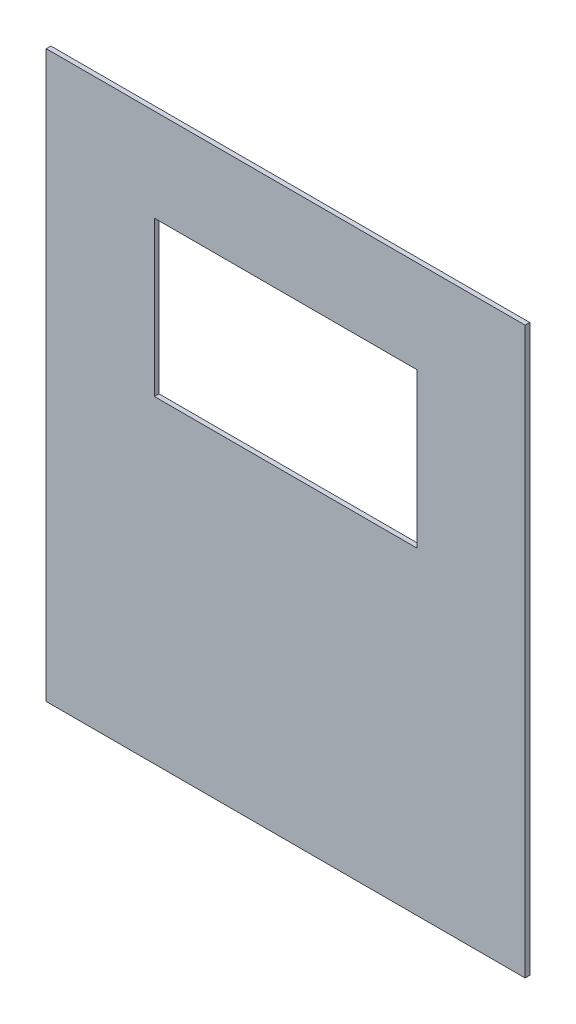
ISO-10303-21;
HEADER;
FILE_DESCRIPTION(('STEP AP214'),'2;1');
FILE_NAME('part.step','',(''),(''),'','','');
FILE_SCHEMA(('AUTOMOTIVE_DESIGN { 1 0 10303 214 1 1 1 1 }'));
ENDSEC;
DATA;
#1=APPLICATION_CONTEXT('core data for automotive mechanical design processes');
#2=APPLICATION_PROTOCOL_DEFINITION('international standard','automotive_design',2000,#1);
#3=PRODUCT_CONTEXT('',#1,'mechanical');
#4=PRODUCT('Part','Part','',(#3));
#5=PRODUCT_RELATED_PRODUCT_CATEGORY('part','',(#4));
#6=PRODUCT_DEFINITION_FORMATION('','',#4);
#7=PRODUCT_DEFINITION_CONTEXT('part definition',#1,'design');
#8=PRODUCT_DEFINITION('design','',#6,#7);
#9=PRODUCT_DEFINITION_SHAPE('','',#8);
#10=(LENGTH_UNIT() NAMED_UNIT(*) SI_UNIT(.MILLI.,.METRE.));
#11=(NAMED_UNIT(*) PLANE_ANGLE_UNIT() SI_UNIT($,.RADIAN.));
#12=(NAMED_UNIT(*) SI_UNIT($,.STERADIAN.) SOLID_ANGLE_UNIT());
#13=UNCERTAINTY_MEASURE_WITH_UNIT(LENGTH_MEASURE(1.E-05),#10,'distance_accuracy_value','');
#14=(GEOMETRIC_REPRESENTATION_CONTEXT(3) GLOBAL_UNCERTAINTY_ASSIGNED_CONTEXT((#13)) GLOBAL_UNIT_ASSIGNED_CONTEXT((#10,
#11,#12)) REPRESENTATION_CONTEXT('',''));
#15=CARTESIAN_POINT('',(0.,0.,0.));
#16=DIRECTION('',(0.,0.,1.));
#17=DIRECTION('',(1.,0.,0.));
#18=AXIS2_PLACEMENT_3D('',#15,#16,#17);
#19=CARTESIAN_POINT('',(0.,0.,3.));
#20=DIRECTION('',(0.,0.,-1.));
#21=DIRECTION('',(-1.,0.,0.));
#22=AXIS2_PLACEMENT_3D('',#19,#20,#21);
#23=PLANE('',#22);
#24=DIRECTION('',(0.,-1.,0.));
#25=VECTOR('',#24,1.);
#26=CARTESIAN_POINT('',(0.,0.,3.));
#27=LINE('',#26,#25);
#28=CARTESIAN_POINT('',(0.,366.,3.));
#29=VERTEX_POINT('',#28);
#30=CARTESIAN_POINT('',(0.,0.,3.));
#31=VERTEX_POINT('',#30);
#32=EDGE_CURVE('E157',#29,#31,#27,.T.);
#33=ORIENTED_EDGE('',*,*,#32,.T.);
#34=DIRECTION('',(1.,0.,0.));
#35=VECTOR('',#34,1.);
#36=CARTESIAN_POINT('',(0.,0.,3.));
#37=LINE('',#36,#35);
#38=CARTESIAN_POINT('',(310.,0.,3.));
#39=VERTEX_POINT('',#38);
#40=EDGE_CURVE('E161',#31,#39,#37,.T.);
#41=ORIENTED_EDGE('',*,*,#40,.T.);
#42=DIRECTION('',(0.,1.,0.));
#43=VECTOR('',#42,1.);
#44=CARTESIAN_POINT('',(310.,0.,3.));
#45=LINE('',#44,#43);
#46=CARTESIAN_POINT('',(310.,366.,3.));
#47=VERTEX_POINT('',#46);
#48=EDGE_CURVE('E165',#39,#47,#45,.T.);
#49=ORIENTED_EDGE('',*,*,#48,.T.);
#50=DIRECTION('',(-1.,0.,0.));
#51=VECTOR('',#50,1.);
#52=CARTESIAN_POINT('',(0.,366.,3.));
#53=LINE('',#52,#51);
#54=EDGE_CURVE('E168',#47,#29,#53,.T.);
#55=ORIENTED_EDGE('',*,*,#54,.T.);
#56=EDGE_LOOP('',(#33,#41,#49,#55));
#57=FACE_BOUND('',#56,.T.);
#58=DIRECTION('',(0.,1.,0.));
#59=VECTOR('',#58,1.);
#60=CARTESIAN_POINT('',(240.,306.,3.));
#61=LINE('',#60,#59);
#62=CARTESIAN_POINT('',(240.,206.,3.));
#63=VERTEX_POINT('',#62);
#64=CARTESIAN_POINT('',(240.,306.,3.));
#65=VERTEX_POINT('',#64);
#66=EDGE_CURVE('E109',#63,#65,#61,.T.);
#67=ORIENTED_EDGE('',*,*,#66,.F.);
#68=DIRECTION('',(1.,0.,0.));
#69=VECTOR('',#68,1.);
#70=CARTESIAN_POINT('',(240.,206.,3.));
#71=LINE('',#70,#69);
#72=CARTESIAN_POINT('',(70.,206.,3.));
#73=VERTEX_POINT('',#72);
#74=EDGE_CURVE('E135',#73,#63,#71,.T.);
#75=ORIENTED_EDGE('',*,*,#74,.F.);
#76=DIRECTION('',(0.,-1.,0.));
#77=VECTOR('',#76,1.);
#78=CARTESIAN_POINT('',(70.,306.,3.));
#79=LINE('',#78,#77);
#80=CARTESIAN_POINT('',(70.,306.,3.));
#81=VERTEX_POINT('',#80);
#82=EDGE_CURVE('E131',#81,#73,#79,.T.);
#83=ORIENTED_EDGE('',*,*,#82,.F.);
#84=DIRECTION('',(-1.,0.,0.));
#85=VECTOR('',#84,1.);
#86=CARTESIAN_POINT('',(240.,306.,3.));
#87=LINE('',#86,#85);
#88=EDGE_CURVE('E118',#65,#81,#87,.T.);
#89=ORIENTED_EDGE('',*,*,#88,.F.);
#90=EDGE_LOOP('',(#67,#75,#83,#89));
#91=FACE_BOUND('',#90,.T.);
#92=ADVANCED_FACE('F43',(#57,#91),#23,.F.);
#93=CARTESIAN_POINT('',(0.,0.,0.));
#94=DIRECTION('',(0.,0.,-1.));
#95=DIRECTION('',(-1.,0.,0.));
#96=AXIS2_PLACEMENT_3D('',#93,#94,#95);
#97=PLANE('',#96);
#98=DIRECTION('',(0.,-1.,0.));
#99=VECTOR('',#98,1.);
#100=CARTESIAN_POINT('',(0.,0.,0.));
#101=LINE('',#100,#99);
#102=CARTESIAN_POINT('',(0.,366.,0.));
#103=VERTEX_POINT('',#102);
#104=CARTESIAN_POINT('',(0.,0.,0.));
#105=VERTEX_POINT('',#104);
#106=EDGE_CURVE('E127',#103,#105,#101,.T.);
#107=ORIENTED_EDGE('',*,*,#106,.F.);
#108=DIRECTION('',(-1.,0.,0.));
#109=VECTOR('',#108,1.);
#110=CARTESIAN_POINT('',(0.,366.,0.));
#111=LINE('',#110,#109);
#112=CARTESIAN_POINT('',(310.,366.,0.));
#113=VERTEX_POINT('',#112);
#114=EDGE_CURVE('E162',#113,#103,#111,.T.);
#115=ORIENTED_EDGE('',*,*,#114,.F.);
#116=DIRECTION('',(0.,1.,0.));
#117=VECTOR('',#116,1.);
#118=CARTESIAN_POINT('',(310.,0.,0.));
#119=LINE('',#118,#117);
#120=CARTESIAN_POINT('',(310.,0.,0.));
#121=VERTEX_POINT('',#120);
#122=EDGE_CURVE('E178',#121,#113,#119,.T.);
#123=ORIENTED_EDGE('',*,*,#122,.F.);
#124=DIRECTION('',(1.,0.,0.));
#125=VECTOR('',#124,1.);
#126=CARTESIAN_POINT('',(0.,0.,0.));
#127=LINE('',#126,#125);
#128=EDGE_CURVE('E175',#105,#121,#127,.T.);
#129=ORIENTED_EDGE('',*,*,#128,.F.);
#130=EDGE_LOOP('',(#107,#115,#123,#129));
#131=FACE_BOUND('',#130,.T.);
#132=DIRECTION('',(1.,0.,0.));
#133=VECTOR('',#132,1.);
#134=CARTESIAN_POINT('',(240.,206.,0.));
#135=LINE('',#134,#133);
#136=CARTESIAN_POINT('',(70.,206.,0.));
#137=VERTEX_POINT('',#136);
#138=CARTESIAN_POINT('',(240.,206.,0.));
#139=VERTEX_POINT('',#138);
#140=EDGE_CURVE('E119',#137,#139,#135,.T.);
#141=ORIENTED_EDGE('',*,*,#140,.T.);
#142=DIRECTION('',(0.,1.,0.));
#143=VECTOR('',#142,1.);
#144=CARTESIAN_POINT('',(240.,306.,0.));
#145=LINE('',#144,#143);
#146=CARTESIAN_POINT('',(240.,306.,0.));
#147=VERTEX_POINT('',#146);
#148=EDGE_CURVE('E67',#139,#147,#145,.T.);
#149=ORIENTED_EDGE('',*,*,#148,.T.);
#150=DIRECTION('',(-1.,0.,0.));
#151=VECTOR('',#150,1.);
#152=CARTESIAN_POINT('',(240.,306.,0.));
#153=LINE('',#152,#151);
#154=CARTESIAN_POINT('',(70.,306.,0.));
#155=VERTEX_POINT('',#154);
#156=EDGE_CURVE('E125',#147,#155,#153,.T.);
#157=ORIENTED_EDGE('',*,*,#156,.T.);
#158=DIRECTION('',(0.,-1.,0.));
#159=VECTOR('',#158,1.);
#160=CARTESIAN_POINT('',(70.,306.,0.));
#161=LINE('',#160,#159);
#162=EDGE_CURVE('E144',#155,#137,#161,.T.);
#163=ORIENTED_EDGE('',*,*,#162,.T.);
#164=EDGE_LOOP('',(#141,#149,#157,#163));
#165=FACE_BOUND('',#164,.T.);
#166=ADVANCED_FACE('F201',(#131,#165),#97,.T.);
#167=CARTESIAN_POINT('',(0.,0.,3.));
#168=DIRECTION('',(1.,0.,0.));
#169=DIRECTION('',(0.,0.,-1.));
#170=AXIS2_PLACEMENT_3D('',#167,#168,#169);
#171=PLANE('',#170);
#172=ORIENTED_EDGE('',*,*,#106,.T.);
#173=DIRECTION('',(0.,0.,-1.));
#174=VECTOR('',#173,1.);
#175=CARTESIAN_POINT('',(0.,0.,3.));
#176=LINE('',#175,#174);
#177=EDGE_CURVE('E11',#31,#105,#176,.T.);
#178=ORIENTED_EDGE('',*,*,#177,.F.);
#179=ORIENTED_EDGE('',*,*,#32,.F.);
#180=DIRECTION('',(0.,0.,-1.));
#181=VECTOR('',#180,1.);
#182=CARTESIAN_POINT('',(0.,366.,3.));
#183=LINE('',#182,#181);
#184=EDGE_CURVE('E171',#29,#103,#183,.T.);
#185=ORIENTED_EDGE('',*,*,#184,.T.);
#186=EDGE_LOOP('',(#172,#178,#179,#185));
#187=FACE_BOUND('',#186,.T.);
#188=ADVANCED_FACE('F45',(#187),#171,.F.);
#189=CARTESIAN_POINT('',(0.,0.,3.));
#190=DIRECTION('',(0.,1.,0.));
#191=DIRECTION('',(0.,0.,1.));
#192=AXIS2_PLACEMENT_3D('',#189,#190,#191);
#193=PLANE('',#192);
#194=ORIENTED_EDGE('',*,*,#128,.T.);
#195=DIRECTION('',(0.,0.,-1.));
#196=VECTOR('',#195,1.);
#197=CARTESIAN_POINT('',(310.,0.,3.));
#198=LINE('',#197,#196);
#199=EDGE_CURVE('E52',#39,#121,#198,.T.);
#200=ORIENTED_EDGE('',*,*,#199,.F.);
#201=ORIENTED_EDGE('',*,*,#40,.F.);
#202=ORIENTED_EDGE('',*,*,#177,.T.);
#203=EDGE_LOOP('',(#194,#200,#201,#202));
#204=FACE_BOUND('',#203,.T.);
#205=ADVANCED_FACE('F211',(#204),#193,.F.);
#206=CARTESIAN_POINT('',(310.,0.,3.));
#207=DIRECTION('',(-1.,0.,0.));
#208=DIRECTION('',(0.,0.,1.));
#209=AXIS2_PLACEMENT_3D('',#206,#207,#208);
#210=PLANE('',#209);
#211=ORIENTED_EDGE('',*,*,#122,.T.);
#212=DIRECTION('',(0.,0.,-1.));
#213=VECTOR('',#212,1.);
#214=CARTESIAN_POINT('',(310.,366.,3.));
#215=LINE('',#214,#213);
#216=EDGE_CURVE('E186',#47,#113,#215,.T.);
#217=ORIENTED_EDGE('',*,*,#216,.F.);
#218=ORIENTED_EDGE('',*,*,#48,.F.);
#219=ORIENTED_EDGE('',*,*,#199,.T.);
#220=EDGE_LOOP('',(#211,#217,#218,#219));
#221=FACE_BOUND('',#220,.T.);
#222=ADVANCED_FACE('F195',(#221),#210,.F.);
#223=CARTESIAN_POINT('',(0.,366.,3.));
#224=DIRECTION('',(0.,-1.,0.));
#225=DIRECTION('',(0.,0.,-1.));
#226=AXIS2_PLACEMENT_3D('',#223,#224,#225);
#227=PLANE('',#226);
#228=ORIENTED_EDGE('',*,*,#114,.T.);
#229=ORIENTED_EDGE('',*,*,#184,.F.);
#230=ORIENTED_EDGE('',*,*,#54,.F.);
#231=ORIENTED_EDGE('',*,*,#216,.T.);
#232=EDGE_LOOP('',(#228,#229,#230,#231));
#233=FACE_BOUND('',#232,.T.);
#234=ADVANCED_FACE('F205',(#233),#227,.F.);
#235=CARTESIAN_POINT('',(240.,306.,3.));
#236=DIRECTION('',(-1.,0.,0.));
#237=DIRECTION('',(0.,-1.,0.));
#238=AXIS2_PLACEMENT_3D('',#235,#236,#237);
#239=PLANE('',#238);
#240=ORIENTED_EDGE('',*,*,#148,.F.);
#241=DIRECTION('',(0.,0.,-1.));
#242=VECTOR('',#241,1.);
#243=CARTESIAN_POINT('',(240.,206.,3.));
#244=LINE('',#243,#242);
#245=EDGE_CURVE('E113',#63,#139,#244,.T.);
#246=ORIENTED_EDGE('',*,*,#245,.F.);
#247=ORIENTED_EDGE('',*,*,#66,.T.);
#248=DIRECTION('',(0.,0.,-1.));
#249=VECTOR('',#248,1.);
#250=CARTESIAN_POINT('',(240.,306.,3.));
#251=LINE('',#250,#249);
#252=EDGE_CURVE('E112',#65,#147,#251,.T.);
#253=ORIENTED_EDGE('',*,*,#252,.T.);
#254=EDGE_LOOP('',(#240,#246,#247,#253));
#255=FACE_BOUND('',#254,.T.);
#256=ADVANCED_FACE('F111',(#255),#239,.T.);
#257=CARTESIAN_POINT('',(240.,306.,3.));
#258=DIRECTION('',(0.,-1.,0.));
#259=DIRECTION('',(1.,0.,0.));
#260=AXIS2_PLACEMENT_3D('',#257,#258,#259);
#261=PLANE('',#260);
#262=ORIENTED_EDGE('',*,*,#156,.F.);
#263=ORIENTED_EDGE('',*,*,#252,.F.);
#264=ORIENTED_EDGE('',*,*,#88,.T.);
#265=DIRECTION('',(0.,0.,-1.));
#266=VECTOR('',#265,1.);
#267=CARTESIAN_POINT('',(70.,306.,3.));
#268=LINE('',#267,#266);
#269=EDGE_CURVE('E128',#81,#155,#268,.T.);
#270=ORIENTED_EDGE('',*,*,#269,.T.);
#271=EDGE_LOOP('',(#262,#263,#264,#270));
#272=FACE_BOUND('',#271,.T.);
#273=ADVANCED_FACE('F122',(#272),#261,.T.);
#274=CARTESIAN_POINT('',(70.,306.,3.));
#275=DIRECTION('',(1.,0.,0.));
#276=DIRECTION('',(0.,1.,0.));
#277=AXIS2_PLACEMENT_3D('',#274,#275,#276);
#278=PLANE('',#277);
#279=ORIENTED_EDGE('',*,*,#162,.F.);
#280=ORIENTED_EDGE('',*,*,#269,.F.);
#281=ORIENTED_EDGE('',*,*,#82,.T.);
#282=DIRECTION('',(0.,0.,-1.));
#283=VECTOR('',#282,1.);
#284=CARTESIAN_POINT('',(70.,206.,3.));
#285=LINE('',#284,#283);
#286=EDGE_CURVE('E59',#73,#137,#285,.T.);
#287=ORIENTED_EDGE('',*,*,#286,.T.);
#288=EDGE_LOOP('',(#279,#280,#281,#287));
#289=FACE_BOUND('',#288,.T.);
#290=ADVANCED_FACE('F234',(#289),#278,.T.);
#291=CARTESIAN_POINT('',(240.,206.,3.));
#292=DIRECTION('',(0.,1.,0.));
#293=DIRECTION('',(-1.,0.,0.));
#294=AXIS2_PLACEMENT_3D('',#291,#292,#293);
#295=PLANE('',#294);
#296=ORIENTED_EDGE('',*,*,#140,.F.);
#297=ORIENTED_EDGE('',*,*,#286,.F.);
#298=ORIENTED_EDGE('',*,*,#74,.T.);
#299=ORIENTED_EDGE('',*,*,#245,.T.);
#300=EDGE_LOOP('',(#296,#297,#298,#299));
#301=FACE_BOUND('',#300,.T.);
#302=ADVANCED_FACE('F238',(#301),#295,.T.);
#303=CLOSED_SHELL('',(#92,#166,#188,#205,#222,#234,#256,#273,#290,#302));
#304=MANIFOLD_SOLID_BREP('B2',#303);
#305=ADVANCED_BREP_SHAPE_REPRESENTATION('',(#18,#304),#14);
#306=SHAPE_DEFINITION_REPRESENTATION(#9,#305);
ENDSEC;
END-ISO-10303-21;
